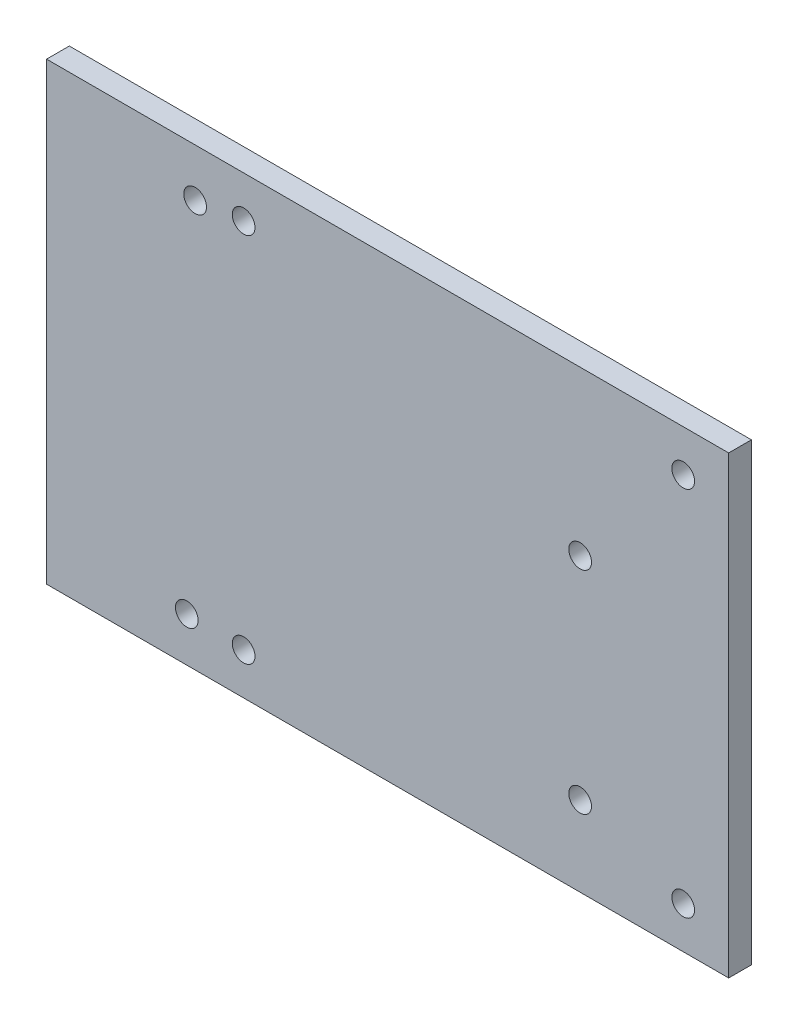
ISO-10303-21;
HEADER;
FILE_DESCRIPTION(('STEP AP214'),'2;1');
FILE_NAME('part.step','',(''),(''),'','','');
FILE_SCHEMA(('AUTOMOTIVE_DESIGN { 1 0 10303 214 1 1 1 1 }'));
ENDSEC;
DATA;
#1=APPLICATION_CONTEXT('core data for automotive mechanical design processes');
#2=APPLICATION_PROTOCOL_DEFINITION('international standard','automotive_design',2000,#1);
#3=PRODUCT_CONTEXT('',#1,'mechanical');
#4=PRODUCT('Part','Part','',(#3));
#5=PRODUCT_RELATED_PRODUCT_CATEGORY('part','',(#4));
#6=PRODUCT_DEFINITION_FORMATION('','',#4);
#7=PRODUCT_DEFINITION_CONTEXT('part definition',#1,'design');
#8=PRODUCT_DEFINITION('design','',#6,#7);
#9=PRODUCT_DEFINITION_SHAPE('','',#8);
#10=(LENGTH_UNIT() NAMED_UNIT(*) SI_UNIT(.MILLI.,.METRE.));
#11=(NAMED_UNIT(*) PLANE_ANGLE_UNIT() SI_UNIT($,.RADIAN.));
#12=(NAMED_UNIT(*) SI_UNIT($,.STERADIAN.) SOLID_ANGLE_UNIT());
#13=UNCERTAINTY_MEASURE_WITH_UNIT(LENGTH_MEASURE(1.E-05),#10,'distance_accuracy_value','');
#14=(GEOMETRIC_REPRESENTATION_CONTEXT(3) GLOBAL_UNCERTAINTY_ASSIGNED_CONTEXT((#13)) GLOBAL_UNIT_ASSIGNED_CONTEXT((#10,
#11,#12)) REPRESENTATION_CONTEXT('',''));
#15=CARTESIAN_POINT('',(0.,0.,0.));
#16=DIRECTION('',(0.,0.,1.));
#17=DIRECTION('',(1.,0.,0.));
#18=AXIS2_PLACEMENT_3D('',#15,#16,#17);
#19=CARTESIAN_POINT('',(0.,0.,3.));
#20=DIRECTION('',(0.,0.,-1.));
#21=DIRECTION('',(-1.,0.,0.));
#22=AXIS2_PLACEMENT_3D('',#19,#20,#21);
#23=PLANE('',#22);
#24=DIRECTION('',(0.,1.,0.));
#25=VECTOR('',#24,1.);
#26=CARTESIAN_POINT('',(45.,30.,3.));
#27=LINE('',#26,#25);
#28=CARTESIAN_POINT('',(45.,-30.,3.));
#29=VERTEX_POINT('',#28);
#30=CARTESIAN_POINT('',(45.,30.,3.));
#31=VERTEX_POINT('',#30);
#32=EDGE_CURVE('E85',#29,#31,#27,.T.);
#33=ORIENTED_EDGE('',*,*,#32,.T.);
#34=DIRECTION('',(-1.,0.,0.));
#35=VECTOR('',#34,1.);
#36=CARTESIAN_POINT('',(-45.,30.,3.));
#37=LINE('',#36,#35);
#38=CARTESIAN_POINT('',(-45.,30.,3.));
#39=VERTEX_POINT('',#38);
#40=EDGE_CURVE('E80',#31,#39,#37,.T.);
#41=ORIENTED_EDGE('',*,*,#40,.T.);
#42=DIRECTION('',(0.,-1.,0.));
#43=VECTOR('',#42,1.);
#44=CARTESIAN_POINT('',(-45.,-30.,3.));
#45=LINE('',#44,#43);
#46=CARTESIAN_POINT('',(-45.,-30.,3.));
#47=VERTEX_POINT('',#46);
#48=EDGE_CURVE('E83',#39,#47,#45,.T.);
#49=ORIENTED_EDGE('',*,*,#48,.T.);
#50=DIRECTION('',(1.,0.,0.));
#51=VECTOR('',#50,1.);
#52=CARTESIAN_POINT('',(45.,-30.,3.));
#53=LINE('',#52,#51);
#54=EDGE_CURVE('E50',#47,#29,#53,.T.);
#55=ORIENTED_EDGE('',*,*,#54,.T.);
#56=EDGE_LOOP('',(#33,#41,#49,#55));
#57=FACE_BOUND('',#56,.T.);
#58=CARTESIAN_POINT('',(-25.4,23.65,3.));
#59=DIRECTION('',(0.,0.,1.));
#60=DIRECTION('',(1.,0.,0.));
#61=AXIS2_PLACEMENT_3D('',#58,#59,#60);
#62=CIRCLE('',#61,1.5);
#63=CARTESIAN_POINT('',(-23.9,23.65,3.));
#64=VERTEX_POINT('',#63);
#65=EDGE_CURVE('E100',#64,#64,#62,.T.);
#66=ORIENTED_EDGE('',*,*,#65,.F.);
#67=EDGE_LOOP('',(#66));
#68=FACE_BOUND('',#67,.T.);
#69=CARTESIAN_POINT('',(-26.5,-24.15,3.));
#70=DIRECTION('',(0.,0.,1.));
#71=DIRECTION('',(1.,0.,0.));
#72=AXIS2_PLACEMENT_3D('',#69,#70,#71);
#73=CIRCLE('',#72,1.5);
#74=CARTESIAN_POINT('',(-25.,-24.15,3.));
#75=VERTEX_POINT('',#74);
#76=EDGE_CURVE('E115',#75,#75,#73,.T.);
#77=ORIENTED_EDGE('',*,*,#76,.F.);
#78=EDGE_LOOP('',(#77));
#79=FACE_BOUND('',#78,.T.);
#80=CARTESIAN_POINT('',(25.4,-19.45,3.));
#81=DIRECTION('',(0.,0.,1.));
#82=DIRECTION('',(1.,0.,0.));
#83=AXIS2_PLACEMENT_3D('',#80,#81,#82);
#84=CIRCLE('',#83,1.5);
#85=CARTESIAN_POINT('',(26.9,-19.45,3.));
#86=VERTEX_POINT('',#85);
#87=EDGE_CURVE('E121',#86,#86,#84,.T.);
#88=ORIENTED_EDGE('',*,*,#87,.F.);
#89=EDGE_LOOP('',(#88));
#90=FACE_BOUND('',#89,.T.);
#91=CARTESIAN_POINT('',(25.4,8.45,3.));
#92=DIRECTION('',(0.,0.,1.));
#93=DIRECTION('',(1.,0.,0.));
#94=AXIS2_PLACEMENT_3D('',#91,#92,#93);
#95=CIRCLE('',#94,1.5);
#96=CARTESIAN_POINT('',(26.9,8.45,3.));
#97=VERTEX_POINT('',#96);
#98=EDGE_CURVE('E127',#97,#97,#95,.T.);
#99=ORIENTED_EDGE('',*,*,#98,.F.);
#100=EDGE_LOOP('',(#99));
#101=FACE_BOUND('',#100,.T.);
#102=CARTESIAN_POINT('',(-19.,-24.5,3.));
#103=DIRECTION('',(0.,0.,1.));
#104=DIRECTION('',(1.,0.,0.));
#105=AXIS2_PLACEMENT_3D('',#102,#103,#104);
#106=CIRCLE('',#105,1.5);
#107=CARTESIAN_POINT('',(-17.5,-24.5,3.));
#108=VERTEX_POINT('',#107);
#109=EDGE_CURVE('E133',#108,#108,#106,.T.);
#110=ORIENTED_EDGE('',*,*,#109,.F.);
#111=EDGE_LOOP('',(#110));
#112=FACE_BOUND('',#111,.T.);
#113=CARTESIAN_POINT('',(-19.,24.5,3.));
#114=DIRECTION('',(0.,0.,1.));
#115=DIRECTION('',(1.,0.,0.));
#116=AXIS2_PLACEMENT_3D('',#113,#114,#115);
#117=CIRCLE('',#116,1.5);
#118=CARTESIAN_POINT('',(-17.5,24.5,3.));
#119=VERTEX_POINT('',#118);
#120=EDGE_CURVE('E139',#119,#119,#117,.T.);
#121=ORIENTED_EDGE('',*,*,#120,.F.);
#122=EDGE_LOOP('',(#121));
#123=FACE_BOUND('',#122,.T.);
#124=CARTESIAN_POINT('',(39.,24.5,3.));
#125=DIRECTION('',(0.,0.,1.));
#126=DIRECTION('',(1.,0.,0.));
#127=AXIS2_PLACEMENT_3D('',#124,#125,#126);
#128=CIRCLE('',#127,1.5);
#129=CARTESIAN_POINT('',(40.5,24.5,3.));
#130=VERTEX_POINT('',#129);
#131=EDGE_CURVE('E145',#130,#130,#128,.T.);
#132=ORIENTED_EDGE('',*,*,#131,.F.);
#133=EDGE_LOOP('',(#132));
#134=FACE_BOUND('',#133,.T.);
#135=CARTESIAN_POINT('',(39.,-24.5,3.));
#136=DIRECTION('',(0.,0.,1.));
#137=DIRECTION('',(1.,0.,0.));
#138=AXIS2_PLACEMENT_3D('',#135,#136,#137);
#139=CIRCLE('',#138,1.5);
#140=CARTESIAN_POINT('',(40.5,-24.5,3.));
#141=VERTEX_POINT('',#140);
#142=EDGE_CURVE('E151',#141,#141,#139,.T.);
#143=ORIENTED_EDGE('',*,*,#142,.F.);
#144=EDGE_LOOP('',(#143));
#145=FACE_BOUND('',#144,.T.);
#146=ADVANCED_FACE('F33',(#57,#68,#79,#90,#101,#112,#123,#134,#145),#23,.F.);
#147=CARTESIAN_POINT('',(0.,0.,0.));
#148=DIRECTION('',(0.,0.,-1.));
#149=DIRECTION('',(-1.,0.,0.));
#150=AXIS2_PLACEMENT_3D('',#147,#148,#149);
#151=PLANE('',#150);
#152=CARTESIAN_POINT('',(39.,24.5,0.));
#153=DIRECTION('',(0.,0.,1.));
#154=DIRECTION('',(1.,0.,0.));
#155=AXIS2_PLACEMENT_3D('',#152,#153,#154);
#156=CIRCLE('',#155,1.5);
#157=CARTESIAN_POINT('',(40.5,24.5,0.));
#158=VERTEX_POINT('',#157);
#159=EDGE_CURVE('E148',#158,#158,#156,.T.);
#160=ORIENTED_EDGE('',*,*,#159,.T.);
#161=EDGE_LOOP('',(#160));
#162=FACE_BOUND('',#161,.T.);
#163=CARTESIAN_POINT('',(-19.,-24.5,0.));
#164=DIRECTION('',(0.,0.,1.));
#165=DIRECTION('',(1.,0.,0.));
#166=AXIS2_PLACEMENT_3D('',#163,#164,#165);
#167=CIRCLE('',#166,1.5);
#168=CARTESIAN_POINT('',(-17.5,-24.5,0.));
#169=VERTEX_POINT('',#168);
#170=EDGE_CURVE('E136',#169,#169,#167,.T.);
#171=ORIENTED_EDGE('',*,*,#170,.T.);
#172=EDGE_LOOP('',(#171));
#173=FACE_BOUND('',#172,.T.);
#174=CARTESIAN_POINT('',(25.4,-19.45,0.));
#175=DIRECTION('',(0.,0.,1.));
#176=DIRECTION('',(1.,0.,0.));
#177=AXIS2_PLACEMENT_3D('',#174,#175,#176);
#178=CIRCLE('',#177,1.5);
#179=CARTESIAN_POINT('',(26.9,-19.45,0.));
#180=VERTEX_POINT('',#179);
#181=EDGE_CURVE('E124',#180,#180,#178,.T.);
#182=ORIENTED_EDGE('',*,*,#181,.T.);
#183=EDGE_LOOP('',(#182));
#184=FACE_BOUND('',#183,.T.);
#185=CARTESIAN_POINT('',(-25.4,23.65,0.));
#186=DIRECTION('',(0.,0.,1.));
#187=DIRECTION('',(1.,0.,0.));
#188=AXIS2_PLACEMENT_3D('',#185,#186,#187);
#189=CIRCLE('',#188,1.5);
#190=CARTESIAN_POINT('',(-23.9,23.65,0.));
#191=VERTEX_POINT('',#190);
#192=EDGE_CURVE('E112',#191,#191,#189,.T.);
#193=ORIENTED_EDGE('',*,*,#192,.T.);
#194=EDGE_LOOP('',(#193));
#195=FACE_BOUND('',#194,.T.);
#196=DIRECTION('',(0.,1.,0.));
#197=VECTOR('',#196,1.);
#198=CARTESIAN_POINT('',(45.,30.,0.));
#199=LINE('',#198,#197);
#200=CARTESIAN_POINT('',(45.,-30.,0.));
#201=VERTEX_POINT('',#200);
#202=CARTESIAN_POINT('',(45.,30.,0.));
#203=VERTEX_POINT('',#202);
#204=EDGE_CURVE('E97',#201,#203,#199,.T.);
#205=ORIENTED_EDGE('',*,*,#204,.F.);
#206=DIRECTION('',(1.,0.,0.));
#207=VECTOR('',#206,1.);
#208=CARTESIAN_POINT('',(45.,-30.,0.));
#209=LINE('',#208,#207);
#210=CARTESIAN_POINT('',(-45.,-30.,0.));
#211=VERTEX_POINT('',#210);
#212=EDGE_CURVE('E73',#211,#201,#209,.T.);
#213=ORIENTED_EDGE('',*,*,#212,.F.);
#214=DIRECTION('',(0.,-1.,0.));
#215=VECTOR('',#214,1.);
#216=CARTESIAN_POINT('',(-45.,-30.,0.));
#217=LINE('',#216,#215);
#218=CARTESIAN_POINT('',(-45.,30.,0.));
#219=VERTEX_POINT('',#218);
#220=EDGE_CURVE('E67',#219,#211,#217,.T.);
#221=ORIENTED_EDGE('',*,*,#220,.F.);
#222=DIRECTION('',(-1.,0.,0.));
#223=VECTOR('',#222,1.);
#224=CARTESIAN_POINT('',(-45.,30.,0.));
#225=LINE('',#224,#223);
#226=EDGE_CURVE('E89',#203,#219,#225,.T.);
#227=ORIENTED_EDGE('',*,*,#226,.F.);
#228=EDGE_LOOP('',(#205,#213,#221,#227));
#229=FACE_BOUND('',#228,.T.);
#230=CARTESIAN_POINT('',(-26.5,-24.15,0.));
#231=DIRECTION('',(0.,0.,1.));
#232=DIRECTION('',(1.,0.,0.));
#233=AXIS2_PLACEMENT_3D('',#230,#231,#232);
#234=CIRCLE('',#233,1.5);
#235=CARTESIAN_POINT('',(-25.,-24.15,0.));
#236=VERTEX_POINT('',#235);
#237=EDGE_CURVE('E118',#236,#236,#234,.T.);
#238=ORIENTED_EDGE('',*,*,#237,.T.);
#239=EDGE_LOOP('',(#238));
#240=FACE_BOUND('',#239,.T.);
#241=CARTESIAN_POINT('',(25.4,8.45,0.));
#242=DIRECTION('',(0.,0.,1.));
#243=DIRECTION('',(1.,0.,0.));
#244=AXIS2_PLACEMENT_3D('',#241,#242,#243);
#245=CIRCLE('',#244,1.5);
#246=CARTESIAN_POINT('',(26.9,8.45,0.));
#247=VERTEX_POINT('',#246);
#248=EDGE_CURVE('E130',#247,#247,#245,.T.);
#249=ORIENTED_EDGE('',*,*,#248,.T.);
#250=EDGE_LOOP('',(#249));
#251=FACE_BOUND('',#250,.T.);
#252=CARTESIAN_POINT('',(-19.,24.5,0.));
#253=DIRECTION('',(0.,0.,1.));
#254=DIRECTION('',(1.,0.,0.));
#255=AXIS2_PLACEMENT_3D('',#252,#253,#254);
#256=CIRCLE('',#255,1.5);
#257=CARTESIAN_POINT('',(-17.5,24.5,0.));
#258=VERTEX_POINT('',#257);
#259=EDGE_CURVE('E142',#258,#258,#256,.T.);
#260=ORIENTED_EDGE('',*,*,#259,.T.);
#261=EDGE_LOOP('',(#260));
#262=FACE_BOUND('',#261,.T.);
#263=CARTESIAN_POINT('',(39.,-24.5,0.));
#264=DIRECTION('',(0.,0.,1.));
#265=DIRECTION('',(1.,0.,0.));
#266=AXIS2_PLACEMENT_3D('',#263,#264,#265);
#267=CIRCLE('',#266,1.5);
#268=CARTESIAN_POINT('',(40.5,-24.5,0.));
#269=VERTEX_POINT('',#268);
#270=EDGE_CURVE('E154',#269,#269,#267,.T.);
#271=ORIENTED_EDGE('',*,*,#270,.T.);
#272=EDGE_LOOP('',(#271));
#273=FACE_BOUND('',#272,.T.);
#274=ADVANCED_FACE('F108',(#162,#173,#184,#195,#229,#240,#251,#262,#273),#151,.T.);
#275=CARTESIAN_POINT('',(45.,30.,3.));
#276=DIRECTION('',(-1.,0.,0.));
#277=DIRECTION('',(0.,-1.,0.));
#278=AXIS2_PLACEMENT_3D('',#275,#276,#277);
#279=PLANE('',#278);
#280=ORIENTED_EDGE('',*,*,#204,.T.);
#281=DIRECTION('',(0.,0.,-1.));
#282=VECTOR('',#281,1.);
#283=CARTESIAN_POINT('',(45.,30.,3.));
#284=LINE('',#283,#282);
#285=EDGE_CURVE('E11',#31,#203,#284,.T.);
#286=ORIENTED_EDGE('',*,*,#285,.F.);
#287=ORIENTED_EDGE('',*,*,#32,.F.);
#288=DIRECTION('',(0.,0.,-1.));
#289=VECTOR('',#288,1.);
#290=CARTESIAN_POINT('',(45.,-30.,3.));
#291=LINE('',#290,#289);
#292=EDGE_CURVE('E93',#29,#201,#291,.T.);
#293=ORIENTED_EDGE('',*,*,#292,.T.);
#294=EDGE_LOOP('',(#280,#286,#287,#293));
#295=FACE_BOUND('',#294,.T.);
#296=ADVANCED_FACE('F35',(#295),#279,.F.);
#297=CARTESIAN_POINT('',(-45.,30.,3.));
#298=DIRECTION('',(0.,-1.,0.));
#299=DIRECTION('',(0.,0.,-1.));
#300=AXIS2_PLACEMENT_3D('',#297,#298,#299);
#301=PLANE('',#300);
#302=ORIENTED_EDGE('',*,*,#226,.T.);
#303=DIRECTION('',(0.,0.,-1.));
#304=VECTOR('',#303,1.);
#305=CARTESIAN_POINT('',(-45.,30.,3.));
#306=LINE('',#305,#304);
#307=EDGE_CURVE('E42',#39,#219,#306,.T.);
#308=ORIENTED_EDGE('',*,*,#307,.F.);
#309=ORIENTED_EDGE('',*,*,#40,.F.);
#310=ORIENTED_EDGE('',*,*,#285,.T.);
#311=EDGE_LOOP('',(#302,#308,#309,#310));
#312=FACE_BOUND('',#311,.T.);
#313=ADVANCED_FACE('F88',(#312),#301,.F.);
#314=CARTESIAN_POINT('',(-45.,-30.,3.));
#315=DIRECTION('',(1.,0.,0.));
#316=DIRECTION('',(0.,1.,0.));
#317=AXIS2_PLACEMENT_3D('',#314,#315,#316);
#318=PLANE('',#317);
#319=ORIENTED_EDGE('',*,*,#220,.T.);
#320=DIRECTION('',(0.,0.,-1.));
#321=VECTOR('',#320,1.);
#322=CARTESIAN_POINT('',(-45.,-30.,3.));
#323=LINE('',#322,#321);
#324=EDGE_CURVE('E90',#47,#211,#323,.T.);
#325=ORIENTED_EDGE('',*,*,#324,.F.);
#326=ORIENTED_EDGE('',*,*,#48,.F.);
#327=ORIENTED_EDGE('',*,*,#307,.T.);
#328=EDGE_LOOP('',(#319,#325,#326,#327));
#329=FACE_BOUND('',#328,.T.);
#330=ADVANCED_FACE('F91',(#329),#318,.F.);
#331=CARTESIAN_POINT('',(45.,-30.,3.));
#332=DIRECTION('',(0.,1.,0.));
#333=DIRECTION('',(-1.,0.,0.));
#334=AXIS2_PLACEMENT_3D('',#331,#332,#333);
#335=PLANE('',#334);
#336=ORIENTED_EDGE('',*,*,#212,.T.);
#337=ORIENTED_EDGE('',*,*,#292,.F.);
#338=ORIENTED_EDGE('',*,*,#54,.F.);
#339=ORIENTED_EDGE('',*,*,#324,.T.);
#340=EDGE_LOOP('',(#336,#337,#338,#339));
#341=FACE_BOUND('',#340,.T.);
#342=ADVANCED_FACE('F105',(#341),#335,.F.);
#343=CARTESIAN_POINT('',(-25.4,23.65,3.));
#344=DIRECTION('',(0.,0.,-1.));
#345=DIRECTION('',(-1.,0.,0.));
#346=AXIS2_PLACEMENT_3D('',#343,#344,#345);
#347=CYLINDRICAL_SURFACE('',#346,1.5);
#348=ORIENTED_EDGE('',*,*,#65,.T.);
#349=EDGE_LOOP('',(#348));
#350=FACE_BOUND('',#349,.T.);
#351=ORIENTED_EDGE('',*,*,#192,.F.);
#352=EDGE_LOOP('',(#351));
#353=FACE_BOUND('',#352,.T.);
#354=ADVANCED_FACE('F171',(#350,#353),#347,.F.);
#355=CARTESIAN_POINT('',(-26.5,-24.15,3.));
#356=DIRECTION('',(0.,0.,-1.));
#357=DIRECTION('',(-1.,0.,0.));
#358=AXIS2_PLACEMENT_3D('',#355,#356,#357);
#359=CYLINDRICAL_SURFACE('',#358,1.5);
#360=ORIENTED_EDGE('',*,*,#76,.T.);
#361=EDGE_LOOP('',(#360));
#362=FACE_BOUND('',#361,.T.);
#363=ORIENTED_EDGE('',*,*,#237,.F.);
#364=EDGE_LOOP('',(#363));
#365=FACE_BOUND('',#364,.T.);
#366=ADVANCED_FACE('F217',(#362,#365),#359,.F.);
#367=CARTESIAN_POINT('',(25.4,-19.45,3.));
#368=DIRECTION('',(0.,0.,-1.));
#369=DIRECTION('',(-1.,0.,0.));
#370=AXIS2_PLACEMENT_3D('',#367,#368,#369);
#371=CYLINDRICAL_SURFACE('',#370,1.5);
#372=ORIENTED_EDGE('',*,*,#87,.T.);
#373=EDGE_LOOP('',(#372));
#374=FACE_BOUND('',#373,.T.);
#375=ORIENTED_EDGE('',*,*,#181,.F.);
#376=EDGE_LOOP('',(#375));
#377=FACE_BOUND('',#376,.T.);
#378=ADVANCED_FACE('F225',(#374,#377),#371,.F.);
#379=CARTESIAN_POINT('',(25.4,8.45,3.));
#380=DIRECTION('',(0.,0.,-1.));
#381=DIRECTION('',(-1.,0.,0.));
#382=AXIS2_PLACEMENT_3D('',#379,#380,#381);
#383=CYLINDRICAL_SURFACE('',#382,1.5);
#384=ORIENTED_EDGE('',*,*,#98,.T.);
#385=EDGE_LOOP('',(#384));
#386=FACE_BOUND('',#385,.T.);
#387=ORIENTED_EDGE('',*,*,#248,.F.);
#388=EDGE_LOOP('',(#387));
#389=FACE_BOUND('',#388,.T.);
#390=ADVANCED_FACE('F233',(#386,#389),#383,.F.);
#391=CARTESIAN_POINT('',(-19.,-24.5,3.));
#392=DIRECTION('',(0.,0.,-1.));
#393=DIRECTION('',(-1.,0.,0.));
#394=AXIS2_PLACEMENT_3D('',#391,#392,#393);
#395=CYLINDRICAL_SURFACE('',#394,1.5);
#396=ORIENTED_EDGE('',*,*,#109,.T.);
#397=EDGE_LOOP('',(#396));
#398=FACE_BOUND('',#397,.T.);
#399=ORIENTED_EDGE('',*,*,#170,.F.);
#400=EDGE_LOOP('',(#399));
#401=FACE_BOUND('',#400,.T.);
#402=ADVANCED_FACE('F242',(#398,#401),#395,.F.);
#403=CARTESIAN_POINT('',(-19.,24.5,3.));
#404=DIRECTION('',(0.,0.,-1.));
#405=DIRECTION('',(-1.,0.,0.));
#406=AXIS2_PLACEMENT_3D('',#403,#404,#405);
#407=CYLINDRICAL_SURFACE('',#406,1.5);
#408=ORIENTED_EDGE('',*,*,#120,.T.);
#409=EDGE_LOOP('',(#408));
#410=FACE_BOUND('',#409,.T.);
#411=ORIENTED_EDGE('',*,*,#259,.F.);
#412=EDGE_LOOP('',(#411));
#413=FACE_BOUND('',#412,.T.);
#414=ADVANCED_FACE('F251',(#410,#413),#407,.F.);
#415=CARTESIAN_POINT('',(39.,24.5,3.));
#416=DIRECTION('',(0.,0.,-1.));
#417=DIRECTION('',(-1.,0.,0.));
#418=AXIS2_PLACEMENT_3D('',#415,#416,#417);
#419=CYLINDRICAL_SURFACE('',#418,1.5);
#420=ORIENTED_EDGE('',*,*,#131,.T.);
#421=EDGE_LOOP('',(#420));
#422=FACE_BOUND('',#421,.T.);
#423=ORIENTED_EDGE('',*,*,#159,.F.);
#424=EDGE_LOOP('',(#423));
#425=FACE_BOUND('',#424,.T.);
#426=ADVANCED_FACE('F260',(#422,#425),#419,.F.);
#427=CARTESIAN_POINT('',(39.,-24.5,3.));
#428=DIRECTION('',(0.,0.,-1.));
#429=DIRECTION('',(-1.,0.,0.));
#430=AXIS2_PLACEMENT_3D('',#427,#428,#429);
#431=CYLINDRICAL_SURFACE('',#430,1.5);
#432=ORIENTED_EDGE('',*,*,#142,.T.);
#433=EDGE_LOOP('',(#432));
#434=FACE_BOUND('',#433,.T.);
#435=ORIENTED_EDGE('',*,*,#270,.F.);
#436=EDGE_LOOP('',(#435));
#437=FACE_BOUND('',#436,.T.);
#438=ADVANCED_FACE('F160',(#434,#437),#431,.F.);
#439=CLOSED_SHELL('',(#146,#274,#296,#313,#330,#342,#354,#366,#378,#390,#402,#414,#426,#438));
#440=MANIFOLD_SOLID_BREP('B2',#439);
#441=ADVANCED_BREP_SHAPE_REPRESENTATION('',(#18,#440),#14);
#442=SHAPE_DEFINITION_REPRESENTATION(#9,#441);
ENDSEC;
END-ISO-10303-21;
